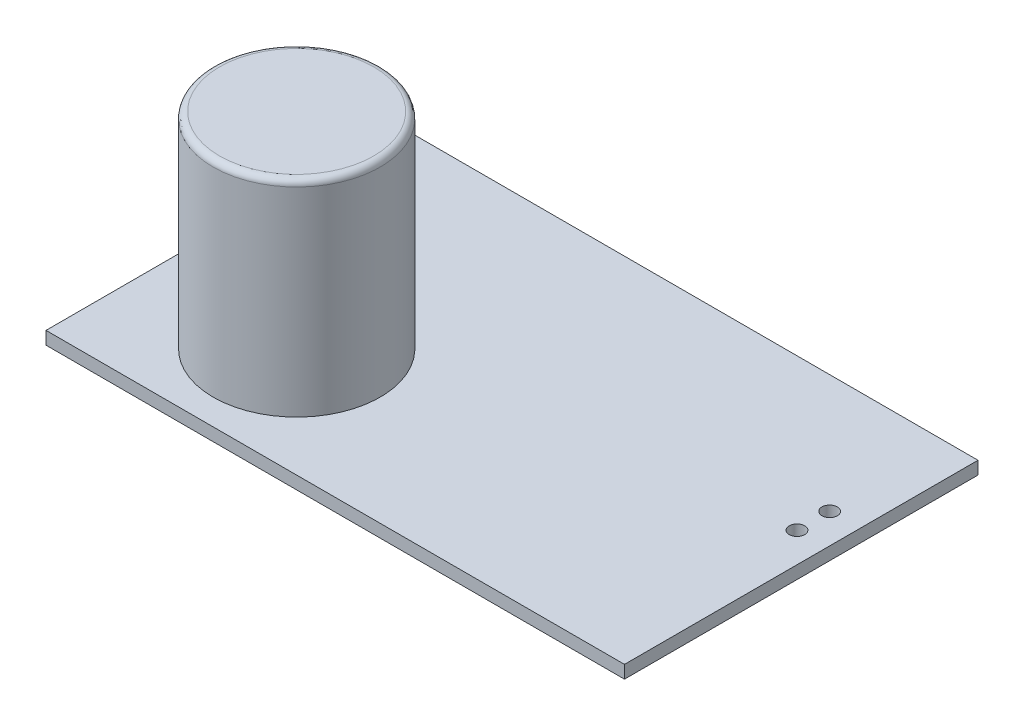
ISO-10303-21;
HEADER;
FILE_DESCRIPTION(('STEP AP214'),'2;1');
FILE_NAME('part.step','',(''),(''),'','','');
FILE_SCHEMA(('AUTOMOTIVE_DESIGN { 1 0 10303 214 1 1 1 1 }'));
ENDSEC;
DATA;
#1=APPLICATION_CONTEXT('core data for automotive mechanical design processes');
#2=APPLICATION_PROTOCOL_DEFINITION('international standard','automotive_design',2000,#1);
#3=PRODUCT_CONTEXT('',#1,'mechanical');
#4=PRODUCT('Part','Part','',(#3));
#5=PRODUCT_RELATED_PRODUCT_CATEGORY('part','',(#4));
#6=PRODUCT_DEFINITION_FORMATION('','',#4);
#7=PRODUCT_DEFINITION_CONTEXT('part definition',#1,'design');
#8=PRODUCT_DEFINITION('design','',#6,#7);
#9=PRODUCT_DEFINITION_SHAPE('','',#8);
#10=(LENGTH_UNIT() NAMED_UNIT(*) SI_UNIT(.MILLI.,.METRE.));
#11=(NAMED_UNIT(*) PLANE_ANGLE_UNIT() SI_UNIT($,.RADIAN.));
#12=(NAMED_UNIT(*) SI_UNIT($,.STERADIAN.) SOLID_ANGLE_UNIT());
#13=UNCERTAINTY_MEASURE_WITH_UNIT(LENGTH_MEASURE(1.E-05),#10,'distance_accuracy_value','');
#14=(GEOMETRIC_REPRESENTATION_CONTEXT(3) GLOBAL_UNCERTAINTY_ASSIGNED_CONTEXT((#13)) GLOBAL_UNIT_ASSIGNED_CONTEXT((#10,
#11,#12)) REPRESENTATION_CONTEXT('',''));
#15=CARTESIAN_POINT('',(0.,0.,0.));
#16=DIRECTION('',(0.,0.,1.));
#17=DIRECTION('',(1.,0.,0.));
#18=AXIS2_PLACEMENT_3D('',#15,#16,#17);
#19=CARTESIAN_POINT('',(11.,17.,-8.5));
#20=DIRECTION('',(0.,-1.,0.));
#21=DIRECTION('',(0.,0.,-1.));
#22=AXIS2_PLACEMENT_3D('',#19,#20,#21);
#23=CYLINDRICAL_SURFACE('',#22,6.5);
#24=CARTESIAN_POINT('',(11.,16.5,-8.5));
#25=DIRECTION('',(0.,1.,0.));
#26=DIRECTION('',(0.,0.,1.));
#27=AXIS2_PLACEMENT_3D('',#24,#25,#26);
#28=CIRCLE('',#27,6.5);
#29=CARTESIAN_POINT('',(11.,16.5,-2.));
#30=VERTEX_POINT('',#29);
#31=EDGE_CURVE('E11',#30,#30,#28,.F.);
#32=ORIENTED_EDGE('',*,*,#31,.T.);
#33=EDGE_LOOP('',(#32));
#34=FACE_BOUND('',#33,.T.);
#35=CARTESIAN_POINT('',(11.,1.,-8.5));
#36=DIRECTION('',(0.,1.,0.));
#37=DIRECTION('',(0.,0.,1.));
#38=AXIS2_PLACEMENT_3D('',#35,#36,#37);
#39=CIRCLE('',#38,6.5);
#40=CARTESIAN_POINT('',(11.,1.,-2.));
#41=VERTEX_POINT('',#40);
#42=EDGE_CURVE('E57',#41,#41,#39,.T.);
#43=ORIENTED_EDGE('',*,*,#42,.T.);
#44=EDGE_LOOP('',(#43));
#45=FACE_BOUND('',#44,.T.);
#46=ADVANCED_FACE('F46',(#34,#45),#23,.T.);
#47=CARTESIAN_POINT('',(11.,17.,-8.5));
#48=DIRECTION('',(0.,1.,0.));
#49=DIRECTION('',(0.,0.,1.));
#50=AXIS2_PLACEMENT_3D('',#47,#48,#49);
#51=PLANE('',#50);
#52=CARTESIAN_POINT('',(11.,17.,-8.5));
#53=DIRECTION('',(0.,1.,0.));
#54=DIRECTION('',(0.,0.,1.));
#55=AXIS2_PLACEMENT_3D('',#52,#53,#54);
#56=CIRCLE('',#55,6.);
#57=CARTESIAN_POINT('',(11.,17.,-2.5));
#58=VERTEX_POINT('',#57);
#59=EDGE_CURVE('E53',#58,#58,#56,.T.);
#60=ORIENTED_EDGE('',*,*,#59,.T.);
#61=EDGE_LOOP('',(#60));
#62=FACE_BOUND('',#61,.T.);
#63=ADVANCED_FACE('F67',(#62),#51,.T.);
#64=CARTESIAN_POINT('',(11.,1.,-8.5));
#65=DIRECTION('',(0.,1.,0.));
#66=DIRECTION('',(0.,0.,1.));
#67=AXIS2_PLACEMENT_3D('',#64,#65,#66);
#68=PLANE('',#67);
#69=ORIENTED_EDGE('',*,*,#42,.F.);
#70=EDGE_LOOP('',(#69));
#71=FACE_BOUND('',#70,.T.);
#72=ADVANCED_FACE('F65',(#71),#68,.F.);
#73=CARTESIAN_POINT('',(11.,16.5,-8.5));
#74=DIRECTION('',(0.,1.,0.));
#75=DIRECTION('',(0.,0.,1.));
#76=AXIS2_PLACEMENT_3D('',#73,#74,#75);
#77=TOROIDAL_SURFACE('',#76,6.,0.5);
#78=ORIENTED_EDGE('',*,*,#31,.F.);
#79=EDGE_LOOP('',(#78));
#80=FACE_BOUND('',#79,.T.);
#81=ORIENTED_EDGE('',*,*,#59,.F.);
#82=EDGE_LOOP('',(#81));
#83=FACE_BOUND('',#82,.T.);
#84=ADVANCED_FACE('F48',(#80,#83),#77,.T.);
#85=CLOSED_SHELL('',(#46,#63,#72,#84));
#86=MANIFOLD_SOLID_BREP('B2',#85);
#87=CARTESIAN_POINT('',(0.,1.,0.));
#88=DIRECTION('',(1.,0.,0.));
#89=DIRECTION('',(0.,0.,-1.));
#90=AXIS2_PLACEMENT_3D('',#87,#88,#89);
#91=PLANE('',#90);
#92=DIRECTION('',(0.,0.,1.));
#93=VECTOR('',#92,1.);
#94=CARTESIAN_POINT('',(0.,0.,0.));
#95=LINE('',#94,#93);
#96=CARTESIAN_POINT('',(0.,0.,-27.5));
#97=VERTEX_POINT('',#96);
#98=CARTESIAN_POINT('',(0.,0.,0.));
#99=VERTEX_POINT('',#98);
#100=EDGE_CURVE('E165',#97,#99,#95,.T.);
#101=ORIENTED_EDGE('',*,*,#100,.T.);
#102=DIRECTION('',(0.,-1.,0.));
#103=VECTOR('',#102,1.);
#104=CARTESIAN_POINT('',(0.,1.,0.));
#105=LINE('',#104,#103);
#106=CARTESIAN_POINT('',(0.,1.,0.));
#107=VERTEX_POINT('',#106);
#108=EDGE_CURVE('E44',#107,#99,#105,.T.);
#109=ORIENTED_EDGE('',*,*,#108,.F.);
#110=DIRECTION('',(0.,0.,1.));
#111=VECTOR('',#110,1.);
#112=CARTESIAN_POINT('',(0.,1.,0.));
#113=LINE('',#112,#111);
#114=CARTESIAN_POINT('',(0.,1.,-27.5));
#115=VERTEX_POINT('',#114);
#116=EDGE_CURVE('E153',#115,#107,#113,.T.);
#117=ORIENTED_EDGE('',*,*,#116,.F.);
#118=DIRECTION('',(0.,-1.,0.));
#119=VECTOR('',#118,1.);
#120=CARTESIAN_POINT('',(0.,1.,-27.5));
#121=LINE('',#120,#119);
#122=EDGE_CURVE('E161',#115,#97,#121,.T.);
#123=ORIENTED_EDGE('',*,*,#122,.T.);
#124=EDGE_LOOP('',(#101,#109,#117,#123));
#125=FACE_BOUND('',#124,.T.);
#126=ADVANCED_FACE('F102',(#125),#91,.F.);
#127=CARTESIAN_POINT('',(0.,1.,0.));
#128=DIRECTION('',(0.,0.,-1.));
#129=DIRECTION('',(-1.,0.,0.));
#130=AXIS2_PLACEMENT_3D('',#127,#128,#129);
#131=PLANE('',#130);
#132=DIRECTION('',(1.,0.,0.));
#133=VECTOR('',#132,1.);
#134=CARTESIAN_POINT('',(0.,0.,0.));
#135=LINE('',#134,#133);
#136=CARTESIAN_POINT('',(45.,0.,0.));
#137=VERTEX_POINT('',#136);
#138=EDGE_CURVE('E157',#99,#137,#135,.T.);
#139=ORIENTED_EDGE('',*,*,#138,.T.);
#140=DIRECTION('',(0.,-1.,0.));
#141=VECTOR('',#140,1.);
#142=CARTESIAN_POINT('',(45.,1.,0.));
#143=LINE('',#142,#141);
#144=CARTESIAN_POINT('',(45.,1.,0.));
#145=VERTEX_POINT('',#144);
#146=EDGE_CURVE('E110',#145,#137,#143,.T.);
#147=ORIENTED_EDGE('',*,*,#146,.F.);
#148=DIRECTION('',(1.,0.,0.));
#149=VECTOR('',#148,1.);
#150=CARTESIAN_POINT('',(0.,1.,0.));
#151=LINE('',#150,#149);
#152=EDGE_CURVE('E148',#107,#145,#151,.T.);
#153=ORIENTED_EDGE('',*,*,#152,.F.);
#154=ORIENTED_EDGE('',*,*,#108,.T.);
#155=EDGE_LOOP('',(#139,#147,#153,#154));
#156=FACE_BOUND('',#155,.T.);
#157=ADVANCED_FACE('F156',(#156),#131,.F.);
#158=CARTESIAN_POINT('',(45.,1.,0.));
#159=DIRECTION('',(-1.,0.,0.));
#160=DIRECTION('',(0.,0.,1.));
#161=AXIS2_PLACEMENT_3D('',#158,#159,#160);
#162=PLANE('',#161);
#163=DIRECTION('',(0.,0.,-1.));
#164=VECTOR('',#163,1.);
#165=CARTESIAN_POINT('',(45.,0.,0.));
#166=LINE('',#165,#164);
#167=CARTESIAN_POINT('',(45.,0.,-27.5));
#168=VERTEX_POINT('',#167);
#169=EDGE_CURVE('E135',#137,#168,#166,.T.);
#170=ORIENTED_EDGE('',*,*,#169,.T.);
#171=DIRECTION('',(0.,-1.,0.));
#172=VECTOR('',#171,1.);
#173=CARTESIAN_POINT('',(45.,1.,-27.5));
#174=LINE('',#173,#172);
#175=CARTESIAN_POINT('',(45.,1.,-27.5));
#176=VERTEX_POINT('',#175);
#177=EDGE_CURVE('E158',#176,#168,#174,.T.);
#178=ORIENTED_EDGE('',*,*,#177,.F.);
#179=DIRECTION('',(0.,0.,-1.));
#180=VECTOR('',#179,1.);
#181=CARTESIAN_POINT('',(45.,1.,0.));
#182=LINE('',#181,#180);
#183=EDGE_CURVE('E151',#145,#176,#182,.T.);
#184=ORIENTED_EDGE('',*,*,#183,.F.);
#185=ORIENTED_EDGE('',*,*,#146,.T.);
#186=EDGE_LOOP('',(#170,#178,#184,#185));
#187=FACE_BOUND('',#186,.T.);
#188=ADVANCED_FACE('F159',(#187),#162,.F.);
#189=CARTESIAN_POINT('',(0.,1.,-27.5));
#190=DIRECTION('',(0.,0.,1.));
#191=DIRECTION('',(1.,0.,0.));
#192=AXIS2_PLACEMENT_3D('',#189,#190,#191);
#193=PLANE('',#192);
#194=DIRECTION('',(-1.,0.,0.));
#195=VECTOR('',#194,1.);
#196=CARTESIAN_POINT('',(0.,0.,-27.5));
#197=LINE('',#196,#195);
#198=EDGE_CURVE('E141',#168,#97,#197,.T.);
#199=ORIENTED_EDGE('',*,*,#198,.T.);
#200=ORIENTED_EDGE('',*,*,#122,.F.);
#201=DIRECTION('',(-1.,0.,0.));
#202=VECTOR('',#201,1.);
#203=CARTESIAN_POINT('',(0.,1.,-27.5));
#204=LINE('',#203,#202);
#205=EDGE_CURVE('E118',#176,#115,#204,.T.);
#206=ORIENTED_EDGE('',*,*,#205,.F.);
#207=ORIENTED_EDGE('',*,*,#177,.T.);
#208=EDGE_LOOP('',(#199,#200,#206,#207));
#209=FACE_BOUND('',#208,.T.);
#210=ADVANCED_FACE('F173',(#209),#193,.F.);
#211=CARTESIAN_POINT('',(0.,1.,0.));
#212=DIRECTION('',(0.,-1.,0.));
#213=DIRECTION('',(0.,0.,-1.));
#214=AXIS2_PLACEMENT_3D('',#211,#212,#213);
#215=PLANE('',#214);
#216=CARTESIAN_POINT('',(42.672,1.,-15.748));
#217=DIRECTION('',(0.,1.,0.));
#218=DIRECTION('',(0.,0.,1.));
#219=AXIS2_PLACEMENT_3D('',#216,#217,#218);
#220=CIRCLE('',#219,0.6);
#221=CARTESIAN_POINT('',(42.672,1.,-15.148));
#222=VERTEX_POINT('',#221);
#223=EDGE_CURVE('E197',#222,#222,#220,.T.);
#224=ORIENTED_EDGE('',*,*,#223,.F.);
#225=EDGE_LOOP('',(#224));
#226=FACE_BOUND('',#225,.T.);
#227=CARTESIAN_POINT('',(42.672,1.,-18.288));
#228=DIRECTION('',(0.,1.,0.));
#229=DIRECTION('',(0.,0.,1.));
#230=AXIS2_PLACEMENT_3D('',#227,#228,#229);
#231=CIRCLE('',#230,0.6);
#232=CARTESIAN_POINT('',(42.672,1.,-17.688));
#233=VERTEX_POINT('',#232);
#234=EDGE_CURVE('E191',#233,#233,#231,.T.);
#235=ORIENTED_EDGE('',*,*,#234,.F.);
#236=EDGE_LOOP('',(#235));
#237=FACE_BOUND('',#236,.T.);
#238=CARTESIAN_POINT('',(2.032,1.,-11.684));
#239=DIRECTION('',(0.,1.,0.));
#240=DIRECTION('',(0.,0.,1.));
#241=AXIS2_PLACEMENT_3D('',#238,#239,#240);
#242=CIRCLE('',#241,0.6);
#243=CARTESIAN_POINT('',(2.032,1.,-11.084));
#244=VERTEX_POINT('',#243);
#245=EDGE_CURVE('E185',#244,#244,#242,.T.);
#246=ORIENTED_EDGE('',*,*,#245,.F.);
#247=EDGE_LOOP('',(#246));
#248=FACE_BOUND('',#247,.T.);
#249=CARTESIAN_POINT('',(2.032,1.,-14.224));
#250=DIRECTION('',(0.,1.,0.));
#251=DIRECTION('',(0.,0.,1.));
#252=AXIS2_PLACEMENT_3D('',#249,#250,#251);
#253=CIRCLE('',#252,0.6);
#254=CARTESIAN_POINT('',(2.032,1.,-13.624));
#255=VERTEX_POINT('',#254);
#256=EDGE_CURVE('E179',#255,#255,#253,.T.);
#257=ORIENTED_EDGE('',*,*,#256,.F.);
#258=EDGE_LOOP('',(#257));
#259=FACE_BOUND('',#258,.T.);
#260=ORIENTED_EDGE('',*,*,#116,.T.);
#261=ORIENTED_EDGE('',*,*,#152,.T.);
#262=ORIENTED_EDGE('',*,*,#183,.T.);
#263=ORIENTED_EDGE('',*,*,#205,.T.);
#264=EDGE_LOOP('',(#260,#261,#262,#263));
#265=FACE_BOUND('',#264,.T.);
#266=ADVANCED_FACE('F149',(#226,#237,#248,#259,#265),#215,.F.);
#267=CARTESIAN_POINT('',(0.,0.,0.));
#268=DIRECTION('',(0.,-1.,0.));
#269=DIRECTION('',(0.,0.,-1.));
#270=AXIS2_PLACEMENT_3D('',#267,#268,#269);
#271=PLANE('',#270);
#272=CARTESIAN_POINT('',(42.672,0.,-15.748));
#273=DIRECTION('',(0.,1.,0.));
#274=DIRECTION('',(0.,0.,1.));
#275=AXIS2_PLACEMENT_3D('',#272,#273,#274);
#276=CIRCLE('',#275,0.6);
#277=CARTESIAN_POINT('',(42.672,0.,-15.148));
#278=VERTEX_POINT('',#277);
#279=EDGE_CURVE('E194',#278,#278,#276,.T.);
#280=ORIENTED_EDGE('',*,*,#279,.T.);
#281=EDGE_LOOP('',(#280));
#282=FACE_BOUND('',#281,.T.);
#283=CARTESIAN_POINT('',(42.672,0.,-18.288));
#284=DIRECTION('',(0.,1.,0.));
#285=DIRECTION('',(0.,0.,1.));
#286=AXIS2_PLACEMENT_3D('',#283,#284,#285);
#287=CIRCLE('',#286,0.6);
#288=CARTESIAN_POINT('',(42.672,0.,-17.688));
#289=VERTEX_POINT('',#288);
#290=EDGE_CURVE('E188',#289,#289,#287,.T.);
#291=ORIENTED_EDGE('',*,*,#290,.T.);
#292=EDGE_LOOP('',(#291));
#293=FACE_BOUND('',#292,.T.);
#294=CARTESIAN_POINT('',(2.032,0.,-11.684));
#295=DIRECTION('',(0.,1.,0.));
#296=DIRECTION('',(0.,0.,1.));
#297=AXIS2_PLACEMENT_3D('',#294,#295,#296);
#298=CIRCLE('',#297,0.6);
#299=CARTESIAN_POINT('',(2.032,0.,-11.084));
#300=VERTEX_POINT('',#299);
#301=EDGE_CURVE('E182',#300,#300,#298,.T.);
#302=ORIENTED_EDGE('',*,*,#301,.T.);
#303=EDGE_LOOP('',(#302));
#304=FACE_BOUND('',#303,.T.);
#305=CARTESIAN_POINT('',(2.032,0.,-14.224));
#306=DIRECTION('',(0.,1.,0.));
#307=DIRECTION('',(0.,0.,1.));
#308=AXIS2_PLACEMENT_3D('',#305,#306,#307);
#309=CIRCLE('',#308,0.6);
#310=CARTESIAN_POINT('',(2.032,0.,-13.624));
#311=VERTEX_POINT('',#310);
#312=EDGE_CURVE('E168',#311,#311,#309,.T.);
#313=ORIENTED_EDGE('',*,*,#312,.T.);
#314=EDGE_LOOP('',(#313));
#315=FACE_BOUND('',#314,.T.);
#316=ORIENTED_EDGE('',*,*,#100,.F.);
#317=ORIENTED_EDGE('',*,*,#198,.F.);
#318=ORIENTED_EDGE('',*,*,#169,.F.);
#319=ORIENTED_EDGE('',*,*,#138,.F.);
#320=EDGE_LOOP('',(#316,#317,#318,#319));
#321=FACE_BOUND('',#320,.T.);
#322=ADVANCED_FACE('F176',(#282,#293,#304,#315,#321),#271,.T.);
#323=CARTESIAN_POINT('',(2.032,0.,-14.224));
#324=DIRECTION('',(0.,1.,0.));
#325=DIRECTION('',(0.,0.,1.));
#326=AXIS2_PLACEMENT_3D('',#323,#324,#325);
#327=CYLINDRICAL_SURFACE('',#326,0.6);
#328=ORIENTED_EDGE('',*,*,#312,.F.);
#329=EDGE_LOOP('',(#328));
#330=FACE_BOUND('',#329,.T.);
#331=ORIENTED_EDGE('',*,*,#256,.T.);
#332=EDGE_LOOP('',(#331));
#333=FACE_BOUND('',#332,.T.);
#334=ADVANCED_FACE('F221',(#330,#333),#327,.F.);
#335=CARTESIAN_POINT('',(2.032,0.,-11.684));
#336=DIRECTION('',(0.,1.,0.));
#337=DIRECTION('',(0.,0.,1.));
#338=AXIS2_PLACEMENT_3D('',#335,#336,#337);
#339=CYLINDRICAL_SURFACE('',#338,0.6);
#340=ORIENTED_EDGE('',*,*,#301,.F.);
#341=EDGE_LOOP('',(#340));
#342=FACE_BOUND('',#341,.T.);
#343=ORIENTED_EDGE('',*,*,#245,.T.);
#344=EDGE_LOOP('',(#343));
#345=FACE_BOUND('',#344,.T.);
#346=ADVANCED_FACE('F223',(#342,#345),#339,.F.);
#347=CARTESIAN_POINT('',(42.672,0.,-18.288));
#348=DIRECTION('',(0.,1.,0.));
#349=DIRECTION('',(0.,0.,1.));
#350=AXIS2_PLACEMENT_3D('',#347,#348,#349);
#351=CYLINDRICAL_SURFACE('',#350,0.6);
#352=ORIENTED_EDGE('',*,*,#290,.F.);
#353=EDGE_LOOP('',(#352));
#354=FACE_BOUND('',#353,.T.);
#355=ORIENTED_EDGE('',*,*,#234,.T.);
#356=EDGE_LOOP('',(#355));
#357=FACE_BOUND('',#356,.T.);
#358=ADVANCED_FACE('F208',(#354,#357),#351,.F.);
#359=CARTESIAN_POINT('',(42.672,0.,-15.748));
#360=DIRECTION('',(0.,1.,0.));
#361=DIRECTION('',(0.,0.,1.));
#362=AXIS2_PLACEMENT_3D('',#359,#360,#361);
#363=CYLINDRICAL_SURFACE('',#362,0.6);
#364=ORIENTED_EDGE('',*,*,#279,.F.);
#365=EDGE_LOOP('',(#364));
#366=FACE_BOUND('',#365,.T.);
#367=ORIENTED_EDGE('',*,*,#223,.T.);
#368=EDGE_LOOP('',(#367));
#369=FACE_BOUND('',#368,.T.);
#370=ADVANCED_FACE('F205',(#366,#369),#363,.F.);
#371=CLOSED_SHELL('',(#126,#157,#188,#210,#266,#322,#334,#346,#358,#370));
#372=MANIFOLD_SOLID_BREP('B6',#371);
#373=ADVANCED_BREP_SHAPE_REPRESENTATION('',(#18,#86,#372),#14);
#374=SHAPE_DEFINITION_REPRESENTATION(#9,#373);
ENDSEC;
END-ISO-10303-21;
